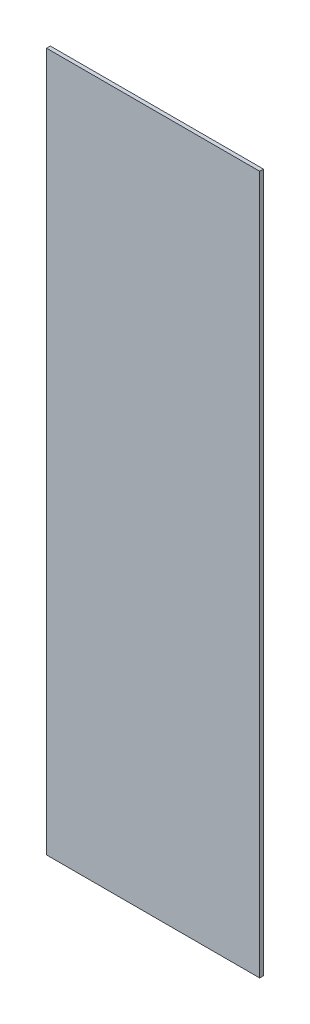
ISO-10303-21;
HEADER;
FILE_DESCRIPTION(('STEP AP214'),'2;1');
FILE_NAME('part.step','',(''),(''),'','','');
FILE_SCHEMA(('AUTOMOTIVE_DESIGN { 1 0 10303 214 1 1 1 1 }'));
ENDSEC;
DATA;
#1=APPLICATION_CONTEXT('core data for automotive mechanical design processes');
#2=APPLICATION_PROTOCOL_DEFINITION('international standard','automotive_design',2000,#1);
#3=PRODUCT_CONTEXT('',#1,'mechanical');
#4=PRODUCT('Part','Part','',(#3));
#5=PRODUCT_RELATED_PRODUCT_CATEGORY('part','',(#4));
#6=PRODUCT_DEFINITION_FORMATION('','',#4);
#7=PRODUCT_DEFINITION_CONTEXT('part definition',#1,'design');
#8=PRODUCT_DEFINITION('design','',#6,#7);
#9=PRODUCT_DEFINITION_SHAPE('','',#8);
#10=(LENGTH_UNIT() NAMED_UNIT(*) SI_UNIT(.MILLI.,.METRE.));
#11=(NAMED_UNIT(*) PLANE_ANGLE_UNIT() SI_UNIT($,.RADIAN.));
#12=(NAMED_UNIT(*) SI_UNIT($,.STERADIAN.) SOLID_ANGLE_UNIT());
#13=UNCERTAINTY_MEASURE_WITH_UNIT(LENGTH_MEASURE(1.E-05),#10,'distance_accuracy_value','');
#14=(GEOMETRIC_REPRESENTATION_CONTEXT(3) GLOBAL_UNCERTAINTY_ASSIGNED_CONTEXT((#13)) GLOBAL_UNIT_ASSIGNED_CONTEXT((#10,
#11,#12)) REPRESENTATION_CONTEXT('',''));
#15=CARTESIAN_POINT('',(0.,0.,0.));
#16=DIRECTION('',(0.,0.,1.));
#17=DIRECTION('',(1.,0.,0.));
#18=AXIS2_PLACEMENT_3D('',#15,#16,#17);
#19=CARTESIAN_POINT('',(-84.4999999999998,277.,3.00000000000053));
#20=DIRECTION('',(0.,1.,0.));
#21=DIRECTION('',(0.,0.,1.));
#22=AXIS2_PLACEMENT_3D('',#19,#20,#21);
#23=PLANE('',#22);
#24=DIRECTION('',(1.,0.,0.));
#25=VECTOR('',#24,1.);
#26=CARTESIAN_POINT('',(-84.4999999999998,277.000000000001,1.08246744900953E-12));
#27=LINE('',#26,#25);
#28=CARTESIAN_POINT('',(-84.4999999999998,277.000000000001,1.08246744900953E-12));
#29=VERTEX_POINT('',#28);
#30=CARTESIAN_POINT('',(84.5000000000002,277.000000000001,3.60822483003176E-13));
#31=VERTEX_POINT('',#30);
#32=EDGE_CURVE('E102',#29,#31,#27,.T.);
#33=ORIENTED_EDGE('',*,*,#32,.F.);
#34=DIRECTION('',(0.,0.,-1.));
#35=VECTOR('',#34,1.);
#36=CARTESIAN_POINT('',(-84.4999999999998,277.,3.00000000000053));
#37=LINE('',#36,#35);
#38=CARTESIAN_POINT('',(-84.4999999999998,277.,3.00000000000053));
#39=VERTEX_POINT('',#38);
#40=EDGE_CURVE('E11',#39,#29,#37,.T.);
#41=ORIENTED_EDGE('',*,*,#40,.F.);
#42=DIRECTION('',(1.,0.,0.));
#43=VECTOR('',#42,1.);
#44=CARTESIAN_POINT('',(-84.4999999999998,277.,3.00000000000053));
#45=LINE('',#44,#43);
#46=CARTESIAN_POINT('',(84.5000000000002,277.000000000002,2.99999999999973));
#47=VERTEX_POINT('',#46);
#48=EDGE_CURVE('E97',#39,#47,#45,.T.);
#49=ORIENTED_EDGE('',*,*,#48,.T.);
#50=DIRECTION('',(0.,0.,-1.));
#51=VECTOR('',#50,1.);
#52=CARTESIAN_POINT('',(84.5000000000002,277.000000000002,2.99999999999973));
#53=LINE('',#52,#51);
#54=EDGE_CURVE('E40',#47,#31,#53,.T.);
#55=ORIENTED_EDGE('',*,*,#54,.T.);
#56=EDGE_LOOP('',(#33,#41,#49,#55));
#57=FACE_BOUND('',#56,.T.);
#58=ADVANCED_FACE('F37',(#57),#23,.T.);
#59=CARTESIAN_POINT('',(-84.4999999999998,277.,3.00000000000053));
#60=DIRECTION('',(1.,0.,0.));
#61=DIRECTION('',(0.,1.,0.));
#62=AXIS2_PLACEMENT_3D('',#59,#60,#61);
#63=PLANE('',#62);
#64=DIRECTION('',(0.,-1.,0.));
#65=VECTOR('',#64,1.);
#66=CARTESIAN_POINT('',(-84.4999999999998,277.000000000001,1.08246744900953E-12));
#67=LINE('',#66,#65);
#68=CARTESIAN_POINT('',(-84.5000000000001,-277.000000000002,6.66133814775094E-13));
#69=VERTEX_POINT('',#68);
#70=EDGE_CURVE('E70',#29,#69,#67,.T.);
#71=ORIENTED_EDGE('',*,*,#70,.T.);
#72=DIRECTION('',(0.,0.,-1.));
#73=VECTOR('',#72,1.);
#74=CARTESIAN_POINT('',(-84.5000000000001,-277.000000000001,3.00000000000078));
#75=LINE('',#74,#73);
#76=CARTESIAN_POINT('',(-84.5000000000001,-277.000000000001,3.00000000000078));
#77=VERTEX_POINT('',#76);
#78=EDGE_CURVE('E46',#77,#69,#75,.T.);
#79=ORIENTED_EDGE('',*,*,#78,.F.);
#80=DIRECTION('',(0.,-1.,0.));
#81=VECTOR('',#80,1.);
#82=CARTESIAN_POINT('',(-84.4999999999998,277.,3.00000000000053));
#83=LINE('',#82,#81);
#84=EDGE_CURVE('E87',#39,#77,#83,.T.);
#85=ORIENTED_EDGE('',*,*,#84,.F.);
#86=ORIENTED_EDGE('',*,*,#40,.T.);
#87=EDGE_LOOP('',(#71,#79,#85,#86));
#88=FACE_BOUND('',#87,.T.);
#89=ADVANCED_FACE('F112',(#88),#63,.F.);
#90=CARTESIAN_POINT('',(-84.5000000000001,-277.000000000001,3.00000000000078));
#91=DIRECTION('',(0.,1.,0.));
#92=DIRECTION('',(0.,0.,1.));
#93=AXIS2_PLACEMENT_3D('',#90,#91,#92);
#94=PLANE('',#93);
#95=DIRECTION('',(1.,0.,0.));
#96=VECTOR('',#95,1.);
#97=CARTESIAN_POINT('',(-84.5000000000001,-277.000000000002,6.66133814775094E-13));
#98=LINE('',#97,#96);
#99=CARTESIAN_POINT('',(84.5,-277.000000000001,-1.94289029309402E-13));
#100=VERTEX_POINT('',#99);
#101=EDGE_CURVE('E94',#69,#100,#98,.T.);
#102=ORIENTED_EDGE('',*,*,#101,.T.);
#103=DIRECTION('',(0.,0.,-1.));
#104=VECTOR('',#103,1.);
#105=CARTESIAN_POINT('',(84.5,-277.000000000001,2.99999999999981));
#106=LINE('',#105,#104);
#107=CARTESIAN_POINT('',(84.5,-277.000000000001,2.99999999999981));
#108=VERTEX_POINT('',#107);
#109=EDGE_CURVE('E91',#108,#100,#106,.T.);
#110=ORIENTED_EDGE('',*,*,#109,.F.);
#111=DIRECTION('',(1.,0.,0.));
#112=VECTOR('',#111,1.);
#113=CARTESIAN_POINT('',(-84.5000000000001,-277.000000000001,3.00000000000078));
#114=LINE('',#113,#112);
#115=EDGE_CURVE('E82',#77,#108,#114,.T.);
#116=ORIENTED_EDGE('',*,*,#115,.F.);
#117=ORIENTED_EDGE('',*,*,#78,.T.);
#118=EDGE_LOOP('',(#102,#110,#116,#117));
#119=FACE_BOUND('',#118,.T.);
#120=ADVANCED_FACE('F92',(#119),#94,.F.);
#121=CARTESIAN_POINT('',(84.5000000000002,277.000000000002,2.99999999999973));
#122=DIRECTION('',(1.,0.,0.));
#123=DIRECTION('',(0.,1.,0.));
#124=AXIS2_PLACEMENT_3D('',#121,#122,#123);
#125=PLANE('',#124);
#126=DIRECTION('',(0.,-1.,0.));
#127=VECTOR('',#126,1.);
#128=CARTESIAN_POINT('',(84.5000000000002,277.000000000001,3.60822483003176E-13));
#129=LINE('',#128,#127);
#130=EDGE_CURVE('E105',#31,#100,#129,.T.);
#131=ORIENTED_EDGE('',*,*,#130,.F.);
#132=ORIENTED_EDGE('',*,*,#54,.F.);
#133=DIRECTION('',(0.,-1.,0.));
#134=VECTOR('',#133,1.);
#135=CARTESIAN_POINT('',(84.5000000000002,277.000000000002,2.99999999999973));
#136=LINE('',#135,#134);
#137=EDGE_CURVE('E86',#47,#108,#136,.T.);
#138=ORIENTED_EDGE('',*,*,#137,.T.);
#139=ORIENTED_EDGE('',*,*,#109,.T.);
#140=EDGE_LOOP('',(#131,#132,#138,#139));
#141=FACE_BOUND('',#140,.T.);
#142=ADVANCED_FACE('F96',(#141),#125,.T.);
#143=CARTESIAN_POINT('',(0.,1.11022302462516E-13,3.00000000000003));
#144=DIRECTION('',(0.,0.,-1.));
#145=DIRECTION('',(-1.,0.,0.));
#146=AXIS2_PLACEMENT_3D('',#143,#144,#145);
#147=PLANE('',#146);
#148=ORIENTED_EDGE('',*,*,#48,.F.);
#149=ORIENTED_EDGE('',*,*,#84,.T.);
#150=ORIENTED_EDGE('',*,*,#115,.T.);
#151=ORIENTED_EDGE('',*,*,#137,.F.);
#152=EDGE_LOOP('',(#148,#149,#150,#151));
#153=FACE_BOUND('',#152,.T.);
#154=ADVANCED_FACE('F85',(#153),#147,.F.);
#155=CARTESIAN_POINT('',(0.,0.,0.));
#156=DIRECTION('',(0.,0.,-1.));
#157=DIRECTION('',(-1.,0.,0.));
#158=AXIS2_PLACEMENT_3D('',#155,#156,#157);
#159=PLANE('',#158);
#160=ORIENTED_EDGE('',*,*,#32,.T.);
#161=ORIENTED_EDGE('',*,*,#130,.T.);
#162=ORIENTED_EDGE('',*,*,#101,.F.);
#163=ORIENTED_EDGE('',*,*,#70,.F.);
#164=EDGE_LOOP('',(#160,#161,#162,#163));
#165=FACE_BOUND('',#164,.T.);
#166=ADVANCED_FACE('F110',(#165),#159,.T.);
#167=CLOSED_SHELL('',(#58,#89,#120,#142,#154,#166));
#168=MANIFOLD_SOLID_BREP('B2',#167);
#169=ADVANCED_BREP_SHAPE_REPRESENTATION('',(#18,#168),#14);
#170=SHAPE_DEFINITION_REPRESENTATION(#9,#169);
ENDSEC;
END-ISO-10303-21;
